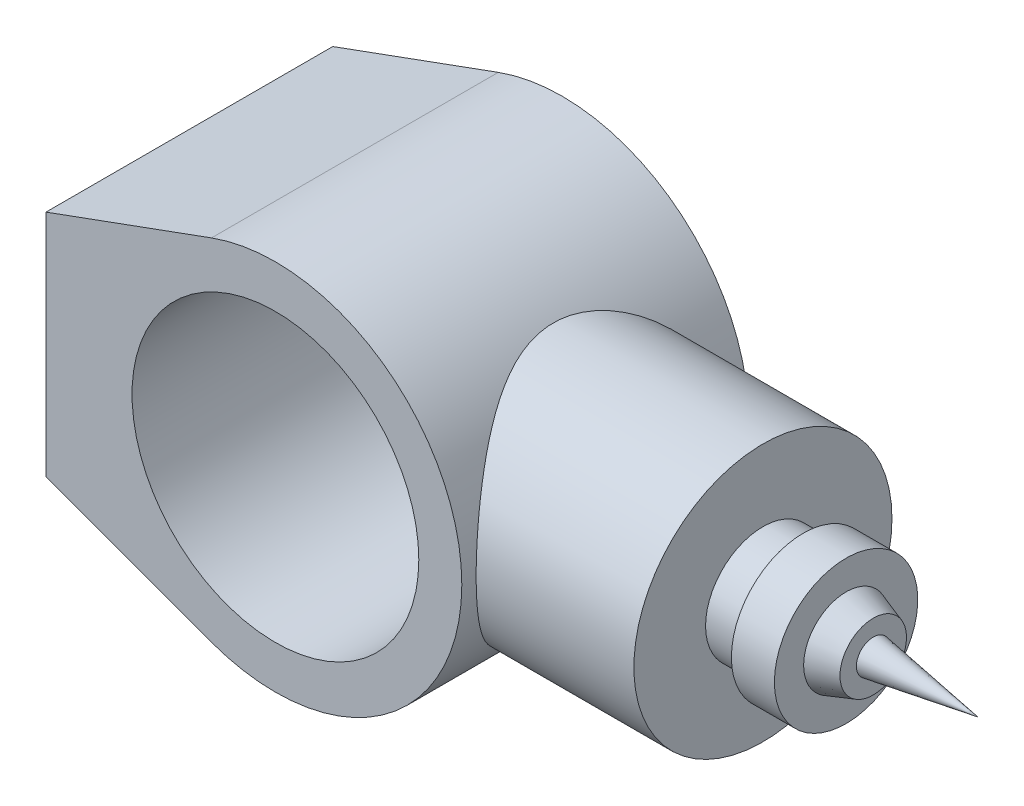
ISO-10303-21;
HEADER;
FILE_DESCRIPTION(('STEP AP214'),'2;1');
FILE_NAME('part.step','',(''),(''),'','','');
FILE_SCHEMA(('AUTOMOTIVE_DESIGN { 1 0 10303 214 1 1 1 1 }'));
ENDSEC;
DATA;
#1=APPLICATION_CONTEXT('core data for automotive mechanical design processes');
#2=APPLICATION_PROTOCOL_DEFINITION('international standard','automotive_design',2000,#1);
#3=PRODUCT_CONTEXT('',#1,'mechanical');
#4=PRODUCT('Part','Part','',(#3));
#5=PRODUCT_RELATED_PRODUCT_CATEGORY('part','',(#4));
#6=PRODUCT_DEFINITION_FORMATION('','',#4);
#7=PRODUCT_DEFINITION_CONTEXT('part definition',#1,'design');
#8=PRODUCT_DEFINITION('design','',#6,#7);
#9=PRODUCT_DEFINITION_SHAPE('','',#8);
#10=(LENGTH_UNIT() NAMED_UNIT(*) SI_UNIT(.MILLI.,.METRE.));
#11=(NAMED_UNIT(*) PLANE_ANGLE_UNIT() SI_UNIT($,.RADIAN.));
#12=(NAMED_UNIT(*) SI_UNIT($,.STERADIAN.) SOLID_ANGLE_UNIT());
#13=UNCERTAINTY_MEASURE_WITH_UNIT(LENGTH_MEASURE(1.E-05),#10,'distance_accuracy_value','');
#14=(GEOMETRIC_REPRESENTATION_CONTEXT(3) GLOBAL_UNCERTAINTY_ASSIGNED_CONTEXT((#13)) GLOBAL_UNIT_ASSIGNED_CONTEXT((#10,
#11,#12)) REPRESENTATION_CONTEXT('',''));
#15=CARTESIAN_POINT('',(0.,0.,0.));
#16=DIRECTION('',(0.,0.,1.));
#17=DIRECTION('',(1.,0.,0.));
#18=AXIS2_PLACEMENT_3D('',#15,#16,#17);
#19=CARTESIAN_POINT('',(0.,0.,50.));
#20=DIRECTION('',(0.,0.,1.));
#21=DIRECTION('',(1.,0.,0.));
#22=AXIS2_PLACEMENT_3D('',#19,#20,#21);
#23=PLANE('',#22);
#24=DIRECTION('',(0.939410286372225,-0.342794856813887,0.));
#25=VECTOR('',#24,1.);
#26=CARTESIAN_POINT('',(-80.,-40.,50.));
#27=LINE('',#26,#25);
#28=CARTESIAN_POINT('',(-80.,-40.,50.));
#29=VERTEX_POINT('',#28);
#30=CARTESIAN_POINT('',(-22.2816656929027,-61.0616686141946,50.));
#31=VERTEX_POINT('',#30);
#32=EDGE_CURVE('E184',#29,#31,#27,.T.);
#33=ORIENTED_EDGE('',*,*,#32,.T.);
#34=CARTESIAN_POINT('',(0.,0.,50.));
#35=DIRECTION('',(0.,0.,1.));
#36=DIRECTION('',(1.,0.,0.));
#37=AXIS2_PLACEMENT_3D('',#34,#35,#36);
#38=CIRCLE('',#37,65.);
#39=CARTESIAN_POINT('',(-22.2816656929027,61.0616686141946,50.));
#40=VERTEX_POINT('',#39);
#41=EDGE_CURVE('E86',#31,#40,#38,.T.);
#42=ORIENTED_EDGE('',*,*,#41,.T.);
#43=DIRECTION('',(-0.939410286372225,-0.342794856813887,0.));
#44=VECTOR('',#43,1.);
#45=CARTESIAN_POINT('',(-80.,40.,50.));
#46=LINE('',#45,#44);
#47=CARTESIAN_POINT('',(-80.,40.,50.));
#48=VERTEX_POINT('',#47);
#49=EDGE_CURVE('E180',#40,#48,#46,.T.);
#50=ORIENTED_EDGE('',*,*,#49,.T.);
#51=DIRECTION('',(0.,-1.,0.));
#52=VECTOR('',#51,1.);
#53=CARTESIAN_POINT('',(-80.,40.,50.));
#54=LINE('',#53,#52);
#55=EDGE_CURVE('E55',#48,#29,#54,.T.);
#56=ORIENTED_EDGE('',*,*,#55,.T.);
#57=EDGE_LOOP('',(#33,#42,#50,#56));
#58=FACE_BOUND('',#57,.T.);
#59=CARTESIAN_POINT('',(0.,0.,50.));
#60=DIRECTION('',(0.,0.,1.));
#61=DIRECTION('',(1.,0.,0.));
#62=AXIS2_PLACEMENT_3D('',#59,#60,#61);
#63=CIRCLE('',#62,50.);
#64=CARTESIAN_POINT('',(50.,0.,50.));
#65=VERTEX_POINT('',#64);
#66=EDGE_CURVE('E194',#65,#65,#63,.T.);
#67=ORIENTED_EDGE('',*,*,#66,.F.);
#68=EDGE_LOOP('',(#67));
#69=FACE_BOUND('',#68,.T.);
#70=ADVANCED_FACE('F38',(#58,#69),#23,.T.);
#71=CARTESIAN_POINT('',(0.,0.,-50.));
#72=DIRECTION('',(0.,0.,1.));
#73=DIRECTION('',(1.,0.,0.));
#74=AXIS2_PLACEMENT_3D('',#71,#72,#73);
#75=PLANE('',#74);
#76=DIRECTION('',(0.939410286372225,-0.342794856813887,0.));
#77=VECTOR('',#76,1.);
#78=CARTESIAN_POINT('',(-80.,-40.,-50.));
#79=LINE('',#78,#77);
#80=CARTESIAN_POINT('',(-80.,-40.,-50.));
#81=VERTEX_POINT('',#80);
#82=CARTESIAN_POINT('',(-22.2816656929027,-61.0616686141946,-50.));
#83=VERTEX_POINT('',#82);
#84=EDGE_CURVE('E178',#81,#83,#79,.T.);
#85=ORIENTED_EDGE('',*,*,#84,.F.);
#86=DIRECTION('',(0.,-1.,0.));
#87=VECTOR('',#86,1.);
#88=CARTESIAN_POINT('',(-80.,40.,-50.));
#89=LINE('',#88,#87);
#90=CARTESIAN_POINT('',(-80.,40.,-50.));
#91=VERTEX_POINT('',#90);
#92=EDGE_CURVE('E79',#91,#81,#89,.T.);
#93=ORIENTED_EDGE('',*,*,#92,.F.);
#94=DIRECTION('',(-0.939410286372225,-0.342794856813887,0.));
#95=VECTOR('',#94,1.);
#96=CARTESIAN_POINT('',(-80.,40.,-50.));
#97=LINE('',#96,#95);
#98=CARTESIAN_POINT('',(-22.2816656929027,61.0616686141946,-50.));
#99=VERTEX_POINT('',#98);
#100=EDGE_CURVE('E73',#99,#91,#97,.T.);
#101=ORIENTED_EDGE('',*,*,#100,.F.);
#102=CARTESIAN_POINT('',(0.,0.,-50.));
#103=DIRECTION('',(0.,0.,1.));
#104=DIRECTION('',(1.,0.,0.));
#105=AXIS2_PLACEMENT_3D('',#102,#103,#104);
#106=CIRCLE('',#105,65.);
#107=EDGE_CURVE('E173',#83,#99,#106,.T.);
#108=ORIENTED_EDGE('',*,*,#107,.F.);
#109=EDGE_LOOP('',(#85,#93,#101,#108));
#110=FACE_BOUND('',#109,.T.);
#111=CARTESIAN_POINT('',(0.,0.,-50.));
#112=DIRECTION('',(0.,0.,1.));
#113=DIRECTION('',(1.,0.,0.));
#114=AXIS2_PLACEMENT_3D('',#111,#112,#113);
#115=CIRCLE('',#114,50.);
#116=CARTESIAN_POINT('',(50.,0.,-50.));
#117=VERTEX_POINT('',#116);
#118=EDGE_CURVE('E196',#117,#117,#115,.T.);
#119=ORIENTED_EDGE('',*,*,#118,.T.);
#120=EDGE_LOOP('',(#119));
#121=FACE_BOUND('',#120,.T.);
#122=ADVANCED_FACE('F152',(#110,#121),#75,.F.);
#123=CARTESIAN_POINT('',(-80.,-40.,50.));
#124=DIRECTION('',(0.342794856813887,0.939410286372225,0.));
#125=DIRECTION('',(-0.939410286372225,0.342794856813887,0.));
#126=AXIS2_PLACEMENT_3D('',#123,#124,#125);
#127=PLANE('',#126);
#128=ORIENTED_EDGE('',*,*,#84,.T.);
#129=DIRECTION('',(0.,0.,-1.));
#130=VECTOR('',#129,1.);
#131=CARTESIAN_POINT('',(-22.2816656929027,-61.0616686141946,50.));
#132=LINE('',#131,#130);
#133=EDGE_CURVE('E11',#31,#83,#132,.T.);
#134=ORIENTED_EDGE('',*,*,#133,.F.);
#135=ORIENTED_EDGE('',*,*,#32,.F.);
#136=DIRECTION('',(0.,0.,-1.));
#137=VECTOR('',#136,1.);
#138=CARTESIAN_POINT('',(-80.,-40.,50.));
#139=LINE('',#138,#137);
#140=EDGE_CURVE('E188',#29,#81,#139,.T.);
#141=ORIENTED_EDGE('',*,*,#140,.T.);
#142=EDGE_LOOP('',(#128,#134,#135,#141));
#143=FACE_BOUND('',#142,.T.);
#144=ADVANCED_FACE('F40',(#143),#127,.F.);
#145=CARTESIAN_POINT('',(0.,0.,50.));
#146=DIRECTION('',(0.,0.,-1.));
#147=DIRECTION('',(-1.,0.,0.));
#148=AXIS2_PLACEMENT_3D('',#145,#146,#147);
#149=CYLINDRICAL_SURFACE('',#148,65.);
#150=CARTESIAN_POINT('',(65.,0.,-45.));
#151=CARTESIAN_POINT('',(65.0000011696057,1.12147330120565,-45.0000012025283));
#152=CARTESIAN_POINT('',(64.9709159765212,2.24292945230778,-44.9580201602482));
#153=CARTESIAN_POINT('',(64.8553068641383,4.47658414079082,-44.790785609369));
#154=CARTESIAN_POINT('',(64.7687842573088,5.58878288911931,-44.6655340035371));
#155=CARTESIAN_POINT('',(64.5403785763001,7.79555151848628,-44.3336771879691));
#156=CARTESIAN_POINT('',(64.3984760503456,8.89011506447751,-44.1270433931238));
#157=CARTESIAN_POINT('',(64.0626457436966,11.0533096019768,-43.6354760134034));
#158=CARTESIAN_POINT('',(63.8687169569864,12.1219400915896,-43.3505409144375));
#159=CARTESIAN_POINT('',(63.4342222744662,14.2212125160505,-42.7078017297046));
#160=CARTESIAN_POINT('',(63.1938918545645,15.2520162370063,-42.3503651251477));
#161=CARTESIAN_POINT('',(62.6709259446924,17.2756280115286,-41.5659763086892));
#162=CARTESIAN_POINT('',(62.3882907364915,18.268436318107,-41.1390245597888));
#163=CARTESIAN_POINT('',(61.786108553932,20.2116697228795,-40.2199419970838));
#164=CARTESIAN_POINT('',(61.4665619062631,21.1620951960855,-39.7278117601444));
#165=CARTESIAN_POINT('',(60.7962171584065,23.0172309124314,-38.6825647509799));
#166=CARTESIAN_POINT('',(60.4454175300334,23.9219389167185,-38.1294449962195));
#167=CARTESIAN_POINT('',(59.6865648974474,25.7601880140228,-36.9151737617935));
#168=CARTESIAN_POINT('',(59.27618815402,26.6893215363404,-36.2488040005491));
#169=CARTESIAN_POINT('',(58.4330275057249,28.4880338622967,-34.8529502059224));
#170=CARTESIAN_POINT('',(58.0002425478181,29.3576098626539,-34.1234632053608));
#171=CARTESIAN_POINT('',(57.1195111836477,31.0364486388513,-32.6040251352403));
#172=CARTESIAN_POINT('',(56.6715447181891,31.8456267033451,-31.8139921794123));
#173=CARTESIAN_POINT('',(55.7691986061138,33.4006700551814,-30.1773036556993));
#174=CARTESIAN_POINT('',(55.3148185876119,34.1465316534289,-29.3306447936721));
#175=CARTESIAN_POINT('',(54.3303114345595,35.6959084068904,-27.4326466159468));
#176=CARTESIAN_POINT('',(53.8005937511269,36.4872853280241,-26.3711450656527));
#177=CARTESIAN_POINT('',(52.7593327891933,37.9773509509911,-24.17604025639));
#178=CARTESIAN_POINT('',(52.2477941160227,38.6760162868262,-23.0424189272517));
#179=CARTESIAN_POINT('',(51.2608149265043,39.9749077721744,-20.7072341856928));
#180=CARTESIAN_POINT('',(50.7853275075273,40.5752630453964,-19.5057627267967));
#181=CARTESIAN_POINT('',(49.8892399163793,41.6721166930025,-17.036931864064));
#182=CARTESIAN_POINT('',(49.4686114171658,42.1686687478853,-15.7696069409943));
#183=CARTESIAN_POINT('',(48.8208029416879,42.9149535309565,-13.5723996352816));
#184=CARTESIAN_POINT('',(48.5738420263557,43.1936925213245,-12.6581208440976));
#185=CARTESIAN_POINT('',(48.1238801744123,43.6944569649788,-10.8035389223551));
#186=CARTESIAN_POINT('',(47.9208721021929,43.9164916250901,-9.86324004407419));
#187=CARTESIAN_POINT('',(47.5660754926548,44.3005296261305,-7.96250438663409));
#188=CARTESIAN_POINT('',(47.4142038087044,44.4626304606427,-7.00210302149487));
#189=CARTESIAN_POINT('',(47.1671263845177,44.7246555122386,-5.06554052628518));
#190=CARTESIAN_POINT('',(47.0719206259529,44.824579749433,-4.08937940131224));
#191=CARTESIAN_POINT('',(46.9418899090943,44.9607388198673,-2.1232364847967));
#192=CARTESIAN_POINT('',(46.9073939345417,44.9966266570423,-1.13320851844658));
#193=CARTESIAN_POINT('',(46.9013571135476,45.0029190462422,0.847248377093852));
#194=CARTESIAN_POINT('',(46.9298161498631,44.9733237202183,1.837677305534));
#195=CARTESIAN_POINT('',(47.0484302849821,44.8492190899201,3.81128752429081));
#196=CARTESIAN_POINT('',(47.13862305521,44.7546701492421,4.79446401850661));
#197=CARTESIAN_POINT('',(47.3768313176079,44.5024241630868,6.74551496467455));
#198=CARTESIAN_POINT('',(47.5248480621437,44.3447257499009,7.71338908473168));
#199=CARTESIAN_POINT('',(47.8621764271841,43.9803320764262,9.56919366964684));
#200=CARTESIAN_POINT('',(48.0484149088864,43.7772163066585,10.4583970625519));
#201=CARTESIAN_POINT('',(48.4609441046406,43.32010640119,12.2144143492181));
#202=CARTESIAN_POINT('',(48.6872496045115,43.0660934784815,13.0812198417583));
#203=CARTESIAN_POINT('',(49.1738509640383,42.5096331932465,14.7898225666927));
#204=CARTESIAN_POINT('',(49.4341648638834,42.2071601049958,15.6316062329481));
#205=CARTESIAN_POINT('',(49.9825182796335,41.5563350032134,17.2876417419013));
#206=CARTESIAN_POINT('',(50.2705534011697,41.2079902580444,18.1018979206949));
#207=CARTESIAN_POINT('',(51.0225431471345,40.2767822129268,20.1137766396802));
#208=CARTESIAN_POINT('',(51.5007434523328,39.6654891440572,21.2930273345177));
#209=CARTESIAN_POINT('',(52.4891158781477,38.348029920852,23.5833678403921));
#210=CARTESIAN_POINT('',(52.9993005340589,37.6418264436726,24.6944305853524));
#211=CARTESIAN_POINT('',(54.0361557973494,36.1376496350166,26.8476775780095));
#212=CARTESIAN_POINT('',(54.5628535785461,35.3395185623559,27.8897384505711));
#213=CARTESIAN_POINT('',(55.6171804467178,33.6558443419671,29.8998791095632));
#214=CARTESIAN_POINT('',(56.1448094104418,32.7703120184234,30.8679680307498));
#215=CARTESIAN_POINT('',(57.1932449701135,30.9045304086319,32.7363921475659));
#216=CARTESIAN_POINT('',(57.7139191350983,29.9233731295192,33.6358963165067));
#217=CARTESIAN_POINT('',(58.7296419536465,27.8771206485979,35.350355349792));
#218=CARTESIAN_POINT('',(59.2246882700661,26.8120178135979,36.1653025097018));
#219=CARTESIAN_POINT('',(60.1756566955639,24.6035209522421,37.7024332048813));
#220=CARTESIAN_POINT('',(60.6316475651595,23.4602711709794,38.4247809320632));
#221=CARTESIAN_POINT('',(61.4931891608211,21.0989507187335,39.7703323765769));
#222=CARTESIAN_POINT('',(61.898755017873,19.8809026570889,40.3935658507715));
#223=CARTESIAN_POINT('',(62.5646802947783,17.6549035875762,41.4059204565395));
#224=CARTESIAN_POINT('',(62.8372982548467,16.6602403417733,41.8163120535009));
#225=CARTESIAN_POINT('',(63.3397164077328,14.6345031625144,42.5675669112335));
#226=CARTESIAN_POINT('',(63.569522535998,13.603434299959,42.9084398107234));
#227=CARTESIAN_POINT('',(63.9815049902596,11.5110112910016,43.5164676119118));
#228=CARTESIAN_POINT('',(64.1637052650743,10.4496726714621,43.7836595836378));
#229=CARTESIAN_POINT('',(64.476639865795,8.30296993183371,44.2409869387356));
#230=CARTESIAN_POINT('',(64.6073730982257,7.21760530180254,44.431120684921));
#231=CARTESIAN_POINT('',(64.8147345736682,5.02649787175023,44.7321113931983));
#232=CARTESIAN_POINT('',(64.8911534961694,3.92069290489763,44.8426616714377));
#233=CARTESIAN_POINT('',(64.9872183357685,1.70145350776208,44.981563734156));
#234=CARTESIAN_POINT('',(65.0068642771874,0.588019080747696,45.0099155538474));
#235=CARTESIAN_POINT('',(64.9889001241945,-1.63741781931566,44.9839662509349));
#236=CARTESIAN_POINT('',(64.9512898349751,-2.74942028747967,44.929664847113));
#237=CARTESIAN_POINT('',(64.819734418053,-4.96298947367603,44.7392747901952));
#238=CARTESIAN_POINT('',(64.7257910494465,-6.06455651648127,44.6031886909653));
#239=CARTESIAN_POINT('',(64.491175703309,-8.18254449212149,44.2620157992034));
#240=CARTESIAN_POINT('',(64.3536808680178,-9.20007959997774,44.0616107864454));
#241=CARTESIAN_POINT('',(64.0337856060908,-11.2121337136589,43.5930613516679));
#242=CARTESIAN_POINT('',(63.8513873855499,-12.2066538475799,43.3249202574929));
#243=CARTESIAN_POINT('',(63.4451725249075,-14.1673074608523,42.7239854011605));
#244=CARTESIAN_POINT('',(63.2213525684632,-15.1334386601223,42.3911864622047));
#245=CARTESIAN_POINT('',(62.736336352677,-17.0327019487273,41.6643868113868));
#246=CARTESIAN_POINT('',(62.4751380044848,-17.965832190203,41.2703826790343));
#247=CARTESIAN_POINT('',(61.8990085085122,-19.8637431772395,40.3931275129008));
#248=CARTESIAN_POINT('',(61.5815209528501,-20.8256806929253,39.9054081529014));
#249=CARTESIAN_POINT('',(60.9142086391395,-22.7035764997345,38.8677076181211));
#250=CARTESIAN_POINT('',(60.5643826081083,-23.6195329786528,38.3177239921568));
#251=CARTESIAN_POINT('',(59.8381347129401,-25.4032558353403,37.1592008079418));
#252=CARTESIAN_POINT('',(59.4616987975441,-26.270996314329,36.5506302507532));
#253=CARTESIAN_POINT('',(58.6884577670336,-27.9557544991496,35.2787474176625));
#254=CARTESIAN_POINT('',(58.2916515549571,-28.7727694681138,34.6154321925309));
#255=CARTESIAN_POINT('',(57.4151711853793,-30.4889708749912,33.1199200847161));
#256=CARTESIAN_POINT('',(56.9328754552547,-31.3785212006928,32.2781812569548));
#257=CARTESIAN_POINT('',(55.9590893109094,-33.0839042215169,30.5278352445589));
#258=CARTESIAN_POINT('',(55.4675975421249,-33.8997259516808,29.6192181500899));
#259=CARTESIAN_POINT('',(54.4860350387397,-35.45586994741,27.7375714933993));
#260=CARTESIAN_POINT('',(53.9959654596117,-36.1961418986443,26.7644997080007));
#261=CARTESIAN_POINT('',(53.0294834997435,-37.5978502361011,24.7568233036382));
#262=CARTESIAN_POINT('',(52.553069328415,-38.2592969946585,23.7222268074148));
#263=CARTESIAN_POINT('',(51.679941347726,-39.4291013564639,21.7149007388747));
#264=CARTESIAN_POINT('',(51.2803372484816,-39.9463152685162,20.7485884228094));
#265=CARTESIAN_POINT('',(50.5123974548912,-40.9130636661729,18.7705314851885));
#266=CARTESIAN_POINT('',(50.1440619804653,-41.3625976757848,17.7587865441704));
#267=CARTESIAN_POINT('',(49.4504928922364,-42.1893301292689,15.693797265063));
#268=CARTESIAN_POINT('',(49.1251906412473,-42.566644202947,14.6406225749502));
#269=CARTESIAN_POINT('',(48.5290098021012,-43.2451098617227,12.4950157035289));
#270=CARTESIAN_POINT('',(48.2581179989952,-43.5462799449171,11.4025931307277));
#271=CARTESIAN_POINT('',(47.8271610412375,-44.0186874861181,9.3921629994351));
#272=CARTESIAN_POINT('',(47.6558419905218,-44.2036946073207,8.47979353570419));
#273=CARTESIAN_POINT('',(47.3627606953031,-44.517583244497,6.63757582668245));
#274=CARTESIAN_POINT('',(47.2409923142224,-44.6464717105955,5.70772976070373));
#275=CARTESIAN_POINT('',(47.05166615705,-44.8459556683364,3.83718735816971));
#276=CARTESIAN_POINT('',(46.9840561376509,-44.9166073394187,2.89650236820514));
#277=CARTESIAN_POINT('',(46.9055698265682,-44.9985645522097,1.01014116515035));
#278=CARTESIAN_POINT('',(46.894694331428,-45.0098692606967,0.0644648821697862));
#279=CARTESIAN_POINT('',(46.9301408777119,-44.972908524549,-1.82506201386804));
#280=CARTESIAN_POINT('',(46.9764888551696,-44.9246160680299,-2.76891160474201));
#281=CARTESIAN_POINT('',(47.1245232303033,-44.7693052695385,-4.64731891289862));
#282=CARTESIAN_POINT('',(47.226209296244,-44.6622872796082,-5.58187668584874));
#283=CARTESIAN_POINT('',(47.4811423262629,-44.3911660407895,-7.43666598606561));
#284=CARTESIAN_POINT('',(47.634452919394,-44.2269923369625,-8.35687836049678));
#285=CARTESIAN_POINT('',(47.9871889035597,-43.8440109221367,-10.1768310643423));
#286=CARTESIAN_POINT('',(48.1866204648689,-43.6251959006593,-11.0765686368372));
#287=CARTESIAN_POINT('',(48.6908782922366,-43.0625185245671,-13.116726178063));
#288=CARTESIAN_POINT('',(49.0093972350599,-42.7008255731353,-14.2488681052183));
#289=CARTESIAN_POINT('',(49.699554494161,-41.8955268796886,-16.4668795226373));
#290=CARTESIAN_POINT('',(50.0712093704162,-41.4518955887103,-17.5527344499461));
#291=CARTESIAN_POINT('',(50.8544123719762,-40.4872212981013,-19.6760329984318));
#292=CARTESIAN_POINT('',(51.2660067549033,-39.9660881554129,-20.7134183727638));
#293=CARTESIAN_POINT('',(52.116211879306,-38.8508952329155,-22.7363587217865));
#294=CARTESIAN_POINT('',(52.5548209260535,-38.2568400254561,-23.7219169406072));
#295=CARTESIAN_POINT('',(53.4579357785502,-36.9847423381263,-25.6613286822633));
#296=CARTESIAN_POINT('',(53.9228021101371,-36.3051118639051,-26.6139712103077));
#297=CARTESIAN_POINT('',(54.8583333343946,-34.8753950985048,-28.4617532840731));
#298=CARTESIAN_POINT('',(55.3289982185488,-34.1253089107936,-29.3568929142368));
#299=CARTESIAN_POINT('',(56.2664339133503,-32.5564691651912,-31.0876310121466));
#300=CARTESIAN_POINT('',(56.7332035093429,-31.7376950080829,-31.923211478402));
#301=CARTESIAN_POINT('',(57.6535165855435,-30.033481652025,-33.5315189390535));
#302=CARTESIAN_POINT('',(58.1070588196762,-29.1480362003111,-34.3042400240121));
#303=CARTESIAN_POINT('',(59.0635284336244,-27.1643113596245,-35.9022819462667));
#304=CARTESIAN_POINT('',(59.5626106290919,-26.0547472869609,-36.7159606163356));
#305=CARTESIAN_POINT('',(60.5176757229357,-23.7521280348398,-38.2458641369291));
#306=CARTESIAN_POINT('',(60.9736519283074,-22.5590599397198,-38.962073861155));
#307=CARTESIAN_POINT('',(61.6149926579414,-20.7127348127311,-39.9558623322098));
#308=CARTESIAN_POINT('',(61.8215919655179,-20.088110583999,-40.2735888165198));
#309=CARTESIAN_POINT('',(62.2191547005856,-18.8206694867556,-40.8812436548858));
#310=CARTESIAN_POINT('',(62.4101203779565,-18.1778552539997,-41.1711760099034));
#311=CARTESIAN_POINT('',(62.7748527233683,-16.875283117665,-41.7219931318356));
#312=CARTESIAN_POINT('',(62.9486230408552,-16.2155288469421,-41.9828840638124));
#313=CARTESIAN_POINT('',(63.2775356475737,-14.8804011558233,-42.4744610119283));
#314=CARTESIAN_POINT('',(63.432679284421,-14.2050288695917,-42.7051492133046));
#315=CARTESIAN_POINT('',(63.8070721968101,-12.4447010544915,-43.25974494481));
#316=CARTESIAN_POINT('',(64.0114184468014,-11.3490405228654,-43.5602757498286));
#317=CARTESIAN_POINT('',(64.3654191982087,-9.12991345978806,-44.078827644396));
#318=CARTESIAN_POINT('',(64.5150820049425,-8.00645117856259,-44.2968612637911));
#319=CARTESIAN_POINT('',(64.7559993187061,-5.74082253729113,-44.6470112993716));
#320=CARTESIAN_POINT('',(64.847297757104,-4.59867091062173,-44.7791923387443));
#321=CARTESIAN_POINT('',(64.9692976296881,-2.30434018473195,-44.9556862638234));
#322=CARTESIAN_POINT('',(64.9999987983895,-1.15216104160189,-44.999998764566));
#323=CARTESIAN_POINT('',(65.,0.,-45.));
#324=B_SPLINE_CURVE_WITH_KNOTS('',3,(#150,#151,#152,#153,#154,#155,#156,#157,#158,#159,#160,
#161,#162,#163,#164,#165,#166,#167,#168,#169,#170,#171,#172,#173,#174,#175,#176,#177,#178,#179,
#180,#181,#182,#183,#184,#185,#186,#187,#188,#189,#190,#191,#192,#193,#194,#195,#196,#197,#198,
#199,#200,#201,#202,#203,#204,#205,#206,#207,#208,#209,#210,#211,#212,#213,#214,#215,#216,#217,
#218,#219,#220,#221,#222,#223,#224,#225,#226,#227,#228,#229,#230,#231,#232,#233,#234,#235,#236,
#237,#238,#239,#240,#241,#242,#243,#244,#245,#246,#247,#248,#249,#250,#251,#252,#253,#254,#255,
#256,#257,#258,#259,#260,#261,#262,#263,#264,#265,#266,#267,#268,#269,#270,#271,#272,#273,#274,
#275,#276,#277,#278,#279,#280,#281,#282,#283,#284,#285,#286,#287,#288,#289,#290,#291,#292,#293,
#294,#295,#296,#297,#298,#299,#300,#301,#302,#303,#304,#305,#306,#307,#308,#309,#310,#311,#312,
#313,#314,#315,#316,#317,#318,#319,#320,#321,#322,#323),.UNSPECIFIED.,.T.,.F.,(4,2,2,2,2,2,2,2,
2,2,2,2,2,2,2,2,2,2,2,2,2,2,2,2,2,2,2,2,2,2,2,2,2,2,2,2,2,2,2,2,2,2,2,2,2,2,2,2,2,2,2,2,2,2,2,2,
2,2,2,2,2,2,2,2,2,2,2,2,2,2,2,2,2,2,2,2,2,2,2,2,2,2,2,2,2,2,4),(0.,3.36323892794144,
6.72640100710137,10.0907454360665,13.4551549250109,16.8029195613731,20.1506619010729,
23.4983746134034,26.8462511096753,30.4871649037346,34.1282499524345,37.7743494260164,
41.4206611917409,45.6939383064405,49.9682903731881,54.2369825353392,58.5034617073671,
61.4625138492405,64.4210852373372,67.3748225577202,70.3285589227263,73.2982527376573,
76.2679410220407,79.2394430998938,82.2110095388412,85.0011411726389,87.7923045951578,
90.584954683776,93.3771628083065,97.6064034875675,101.837312178738,106.075592113262,
110.313347816192,114.596218662803,118.879479402292,123.155037051935,127.429308626693,
130.755998382163,134.082226580387,137.406778235214,140.731400520075,144.068767009318,
147.406132068879,150.743508483461,154.080780688207,157.215791533369,160.350648386749,
163.485756334407,166.621039552604,169.990545063149,173.360183268584,176.73161428665,
180.103227050672,184.047902440152,187.993163521895,191.94103513809,195.888386692538,
199.385185586645,202.88200907258,206.373186157811,209.863514294626,212.700365177753,
215.536864625513,218.370624567028,221.204424293963,224.039508887241,226.874576485218,
229.713151272815,232.55210603787,236.23803941247,239.925124033801,243.616531168718,
247.307706963636,251.081871120678,254.856029735252,258.631324277359,262.406973327354,
266.792058434818,271.177823293658,273.368885604935,275.55963203795,277.749912517597,
279.940034437727,283.398420446896,286.856280978073,290.31153567335,293.766805506531),.UNSPECIFIED.);
#325=CARTESIAN_POINT('',(65.,0.,-45.));
#326=VERTEX_POINT('',#325);
#327=EDGE_CURVE('E119',#326,#326,#324,.T.);
#328=ORIENTED_EDGE('',*,*,#327,.F.);
#329=EDGE_LOOP('',(#328));
#330=FACE_BOUND('',#329,.T.);
#331=ORIENTED_EDGE('',*,*,#107,.T.);
#332=DIRECTION('',(0.,0.,-1.));
#333=VECTOR('',#332,1.);
#334=CARTESIAN_POINT('',(-22.2816656929027,61.0616686141946,50.));
#335=LINE('',#334,#333);
#336=EDGE_CURVE('E47',#40,#99,#335,.T.);
#337=ORIENTED_EDGE('',*,*,#336,.F.);
#338=ORIENTED_EDGE('',*,*,#41,.F.);
#339=ORIENTED_EDGE('',*,*,#133,.T.);
#340=EDGE_LOOP('',(#331,#337,#338,#339));
#341=FACE_BOUND('',#340,.T.);
#342=ADVANCED_FACE('F165',(#330,#341),#149,.T.);
#343=CARTESIAN_POINT('',(-80.,40.,50.));
#344=DIRECTION('',(0.342794856813887,-0.939410286372225,0.));
#345=DIRECTION('',(0.939410286372225,0.342794856813887,0.));
#346=AXIS2_PLACEMENT_3D('',#343,#344,#345);
#347=PLANE('',#346);
#348=ORIENTED_EDGE('',*,*,#100,.T.);
#349=DIRECTION('',(0.,0.,-1.));
#350=VECTOR('',#349,1.);
#351=CARTESIAN_POINT('',(-80.,40.,50.));
#352=LINE('',#351,#350);
#353=EDGE_CURVE('E181',#48,#91,#352,.T.);
#354=ORIENTED_EDGE('',*,*,#353,.F.);
#355=ORIENTED_EDGE('',*,*,#49,.F.);
#356=ORIENTED_EDGE('',*,*,#336,.T.);
#357=EDGE_LOOP('',(#348,#354,#355,#356));
#358=FACE_BOUND('',#357,.T.);
#359=ADVANCED_FACE('F163',(#358),#347,.F.);
#360=CARTESIAN_POINT('',(-80.,40.,50.));
#361=DIRECTION('',(1.,0.,0.));
#362=DIRECTION('',(0.,0.,-1.));
#363=AXIS2_PLACEMENT_3D('',#360,#361,#362);
#364=PLANE('',#363);
#365=ORIENTED_EDGE('',*,*,#92,.T.);
#366=ORIENTED_EDGE('',*,*,#140,.F.);
#367=ORIENTED_EDGE('',*,*,#55,.F.);
#368=ORIENTED_EDGE('',*,*,#353,.T.);
#369=EDGE_LOOP('',(#365,#366,#367,#368));
#370=FACE_BOUND('',#369,.T.);
#371=ADVANCED_FACE('F149',(#370),#364,.F.);
#372=CARTESIAN_POINT('',(0.,0.,50.));
#373=DIRECTION('',(0.,0.,-1.));
#374=DIRECTION('',(-1.,0.,0.));
#375=AXIS2_PLACEMENT_3D('',#372,#373,#374);
#376=CYLINDRICAL_SURFACE('',#375,50.);
#377=ORIENTED_EDGE('',*,*,#66,.T.);
#378=EDGE_LOOP('',(#377));
#379=FACE_BOUND('',#378,.T.);
#380=ORIENTED_EDGE('',*,*,#118,.F.);
#381=EDGE_LOOP('',(#380));
#382=FACE_BOUND('',#381,.T.);
#383=ADVANCED_FACE('F140',(#379,#382),#376,.F.);
#384=CARTESIAN_POINT('',(-80.002,0.,0.));
#385=DIRECTION('',(1.,0.,0.));
#386=DIRECTION('',(0.,0.,-1.));
#387=AXIS2_PLACEMENT_3D('',#384,#385,#386);
#388=CYLINDRICAL_SURFACE('',#387,45.);
#389=CARTESIAN_POINT('',(120.,0.,0.));
#390=DIRECTION('',(1.,0.,0.));
#391=DIRECTION('',(0.,0.,-1.));
#392=AXIS2_PLACEMENT_3D('',#389,#390,#391);
#393=CIRCLE('',#392,45.);
#394=CARTESIAN_POINT('',(120.,0.,-45.));
#395=VERTEX_POINT('',#394);
#396=EDGE_CURVE('E127',#395,#395,#393,.T.);
#397=ORIENTED_EDGE('',*,*,#396,.F.);
#398=EDGE_LOOP('',(#397));
#399=FACE_BOUND('',#398,.T.);
#400=ORIENTED_EDGE('',*,*,#327,.T.);
#401=EDGE_LOOP('',(#400));
#402=FACE_BOUND('',#401,.T.);
#403=ADVANCED_FACE('F129',(#399,#402),#388,.T.);
#404=CARTESIAN_POINT('',(120.,0.,0.));
#405=DIRECTION('',(1.,0.,0.));
#406=DIRECTION('',(0.,0.,-1.));
#407=AXIS2_PLACEMENT_3D('',#404,#405,#406);
#408=PLANE('',#407);
#409=CARTESIAN_POINT('',(120.,0.,0.));
#410=DIRECTION('',(-1.,0.,0.));
#411=DIRECTION('',(0.,0.,1.));
#412=AXIS2_PLACEMENT_3D('',#409,#410,#411);
#413=CIRCLE('',#412,20.);
#414=CARTESIAN_POINT('',(120.,0.,20.));
#415=VERTEX_POINT('',#414);
#416=EDGE_CURVE('E116',#415,#415,#413,.T.);
#417=ORIENTED_EDGE('',*,*,#416,.T.);
#418=EDGE_LOOP('',(#417));
#419=FACE_BOUND('',#418,.T.);
#420=ORIENTED_EDGE('',*,*,#396,.T.);
#421=EDGE_LOOP('',(#420));
#422=FACE_BOUND('',#421,.T.);
#423=ADVANCED_FACE('F137',(#419,#422),#408,.T.);
#424=CARTESIAN_POINT('',(0.,0.,0.));
#425=DIRECTION('',(-1.,0.,0.));
#426=DIRECTION('',(0.,0.,1.));
#427=AXIS2_PLACEMENT_3D('',#424,#425,#426);
#428=CYLINDRICAL_SURFACE('',#427,20.);
#429=CARTESIAN_POINT('',(134.,0.,0.));
#430=DIRECTION('',(-1.,0.,0.));
#431=DIRECTION('',(0.,0.,1.));
#432=AXIS2_PLACEMENT_3D('',#429,#430,#431);
#433=CIRCLE('',#432,20.);
#434=CARTESIAN_POINT('',(134.,0.,20.));
#435=VERTEX_POINT('',#434);
#436=EDGE_CURVE('E113',#435,#435,#433,.T.);
#437=ORIENTED_EDGE('',*,*,#436,.T.);
#438=EDGE_LOOP('',(#437));
#439=FACE_BOUND('',#438,.T.);
#440=ORIENTED_EDGE('',*,*,#416,.F.);
#441=EDGE_LOOP('',(#440));
#442=FACE_BOUND('',#441,.T.);
#443=ADVANCED_FACE('F135',(#439,#442),#428,.T.);
#444=CARTESIAN_POINT('',(134.,-20.,0.));
#445=DIRECTION('',(-1.,0.,0.));
#446=DIRECTION('',(0.,0.,1.));
#447=AXIS2_PLACEMENT_3D('',#444,#445,#446);
#448=PLANE('',#447);
#449=CARTESIAN_POINT('',(134.,0.,0.));
#450=DIRECTION('',(-1.,0.,0.));
#451=DIRECTION('',(0.,0.,1.));
#452=AXIS2_PLACEMENT_3D('',#449,#450,#451);
#453=CIRCLE('',#452,25.);
#454=CARTESIAN_POINT('',(134.,0.,25.));
#455=VERTEX_POINT('',#454);
#456=EDGE_CURVE('E110',#455,#455,#453,.T.);
#457=ORIENTED_EDGE('',*,*,#456,.T.);
#458=EDGE_LOOP('',(#457));
#459=FACE_BOUND('',#458,.T.);
#460=ORIENTED_EDGE('',*,*,#436,.F.);
#461=EDGE_LOOP('',(#460));
#462=FACE_BOUND('',#461,.T.);
#463=ADVANCED_FACE('F144',(#459,#462),#448,.T.);
#464=CARTESIAN_POINT('',(0.,0.,0.));
#465=DIRECTION('',(-1.,0.,0.));
#466=DIRECTION('',(0.,0.,1.));
#467=AXIS2_PLACEMENT_3D('',#464,#465,#466);
#468=CYLINDRICAL_SURFACE('',#467,25.);
#469=CARTESIAN_POINT('',(149.,0.,0.));
#470=DIRECTION('',(-1.,0.,0.));
#471=DIRECTION('',(0.,0.,1.));
#472=AXIS2_PLACEMENT_3D('',#469,#470,#471);
#473=CIRCLE('',#472,25.);
#474=CARTESIAN_POINT('',(149.,0.,25.));
#475=VERTEX_POINT('',#474);
#476=EDGE_CURVE('E107',#475,#475,#473,.T.);
#477=ORIENTED_EDGE('',*,*,#476,.T.);
#478=EDGE_LOOP('',(#477));
#479=FACE_BOUND('',#478,.T.);
#480=ORIENTED_EDGE('',*,*,#456,.F.);
#481=EDGE_LOOP('',(#480));
#482=FACE_BOUND('',#481,.T.);
#483=ADVANCED_FACE('F263',(#479,#482),#468,.T.);
#484=CARTESIAN_POINT('',(149.,-25.,0.));
#485=DIRECTION('',(1.,0.,0.));
#486=DIRECTION('',(0.,0.,-1.));
#487=AXIS2_PLACEMENT_3D('',#484,#485,#486);
#488=PLANE('',#487);
#489=CARTESIAN_POINT('',(149.,0.,0.));
#490=DIRECTION('',(-1.,0.,0.));
#491=DIRECTION('',(0.,0.,1.));
#492=AXIS2_PLACEMENT_3D('',#489,#490,#491);
#493=CIRCLE('',#492,14.8061601348799);
#494=CARTESIAN_POINT('',(149.,0.,14.8061601348799));
#495=VERTEX_POINT('',#494);
#496=EDGE_CURVE('E102',#495,#495,#493,.T.);
#497=ORIENTED_EDGE('',*,*,#496,.T.);
#498=EDGE_LOOP('',(#497));
#499=FACE_BOUND('',#498,.T.);
#500=ORIENTED_EDGE('',*,*,#476,.F.);
#501=EDGE_LOOP('',(#500));
#502=FACE_BOUND('',#501,.T.);
#503=ADVANCED_FACE('F271',(#499,#502),#488,.T.);
#504=CARTESIAN_POINT('',(149.,0.,0.));
#505=DIRECTION('',(-1.,0.,0.));
#506=DIRECTION('',(0.,0.,1.));
#507=AXIS2_PLACEMENT_3D('',#504,#505,#506);
#508=CONICAL_SURFACE('',#507,14.8061601348799,0.326866274204708);
#509=CARTESIAN_POINT('',(158.470531586869,0.,0.));
#510=DIRECTION('',(-1.,0.,0.));
#511=DIRECTION('',(0.,0.,1.));
#512=AXIS2_PLACEMENT_3D('',#509,#510,#511);
#513=CIRCLE('',#512,11.5953920862466);
#514=CARTESIAN_POINT('',(158.470531586869,0.,11.5953920862466));
#515=VERTEX_POINT('',#514);
#516=EDGE_CURVE('E99',#515,#515,#513,.T.);
#517=ORIENTED_EDGE('',*,*,#516,.T.);
#518=EDGE_LOOP('',(#517));
#519=FACE_BOUND('',#518,.T.);
#520=ORIENTED_EDGE('',*,*,#496,.F.);
#521=EDGE_LOOP('',(#520));
#522=FACE_BOUND('',#521,.T.);
#523=ADVANCED_FACE('F281',(#519,#522),#508,.T.);
#524=CARTESIAN_POINT('',(158.470531586869,-11.5953920862466,0.));
#525=DIRECTION('',(1.,0.,0.));
#526=DIRECTION('',(0.,0.,-1.));
#527=AXIS2_PLACEMENT_3D('',#524,#525,#526);
#528=PLANE('',#527);
#529=CARTESIAN_POINT('',(158.470531586869,0.,0.));
#530=DIRECTION('',(-1.,0.,0.));
#531=DIRECTION('',(0.,0.,1.));
#532=AXIS2_PLACEMENT_3D('',#529,#530,#531);
#533=CIRCLE('',#532,5.88200114366089);
#534=CARTESIAN_POINT('',(158.470531586869,0.,5.88200114366089));
#535=VERTEX_POINT('',#534);
#536=EDGE_CURVE('E97',#535,#535,#533,.T.);
#537=ORIENTED_EDGE('',*,*,#536,.T.);
#538=EDGE_LOOP('',(#537));
#539=FACE_BOUND('',#538,.T.);
#540=ORIENTED_EDGE('',*,*,#516,.F.);
#541=EDGE_LOOP('',(#540));
#542=FACE_BOUND('',#541,.T.);
#543=ADVANCED_FACE('F93',(#539,#542),#528,.T.);
#544=CARTESIAN_POINT('',(158.470531586869,0.,0.));
#545=DIRECTION('',(-1.,0.,0.));
#546=DIRECTION('',(0.,0.,1.));
#547=AXIS2_PLACEMENT_3D('',#544,#545,#546);
#548=CONICAL_SURFACE('',#547,5.88200114366089,0.15965034090414);
#549=CARTESIAN_POINT('',(195.,0.,0.));
#550=VERTEX_POINT('',#549);
#551=VERTEX_LOOP('',#550);
#552=FACE_BOUND('',#551,.T.);
#553=ORIENTED_EDGE('',*,*,#536,.F.);
#554=EDGE_LOOP('',(#553));
#555=FACE_BOUND('',#554,.T.);
#556=ADVANCED_FACE('F90',(#552,#555),#548,.T.);
#557=CLOSED_SHELL('',(#70,#122,#144,#342,#359,#371,#383,#403,#423,#443,#463,#483,#503,#523,#543,#556));
#558=MANIFOLD_SOLID_BREP('B2',#557);
#559=ADVANCED_BREP_SHAPE_REPRESENTATION('',(#18,#558),#14);
#560=SHAPE_DEFINITION_REPRESENTATION(#9,#559);
ENDSEC;
END-ISO-10303-21;
